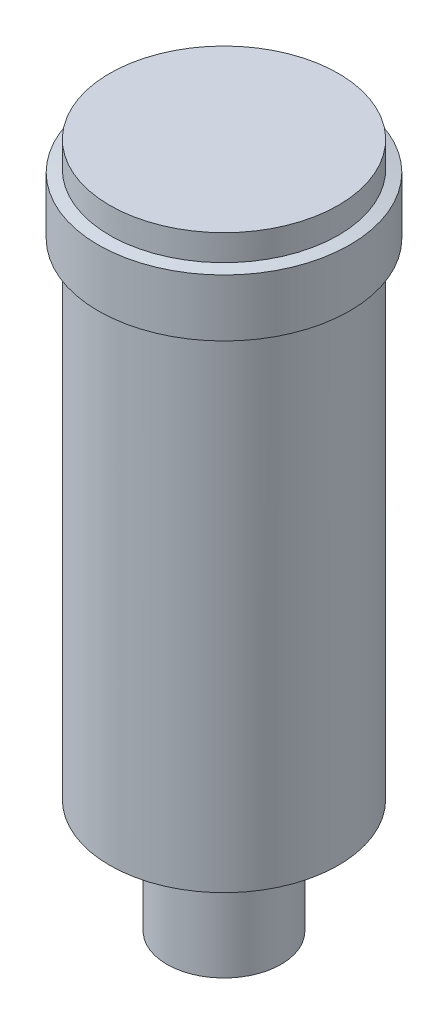
ISO-10303-21;
HEADER;
FILE_DESCRIPTION(('STEP AP214'),'2;1');
FILE_NAME('part.step','',(''),(''),'','','');
FILE_SCHEMA(('AUTOMOTIVE_DESIGN { 1 0 10303 214 1 1 1 1 }'));
ENDSEC;
DATA;
#1=APPLICATION_CONTEXT('core data for automotive mechanical design processes');
#2=APPLICATION_PROTOCOL_DEFINITION('international standard','automotive_design',2000,#1);
#3=PRODUCT_CONTEXT('',#1,'mechanical');
#4=PRODUCT('Part','Part','',(#3));
#5=PRODUCT_RELATED_PRODUCT_CATEGORY('part','',(#4));
#6=PRODUCT_DEFINITION_FORMATION('','',#4);
#7=PRODUCT_DEFINITION_CONTEXT('part definition',#1,'design');
#8=PRODUCT_DEFINITION('design','',#6,#7);
#9=PRODUCT_DEFINITION_SHAPE('','',#8);
#10=(LENGTH_UNIT() NAMED_UNIT(*) SI_UNIT(.MILLI.,.METRE.));
#11=(NAMED_UNIT(*) PLANE_ANGLE_UNIT() SI_UNIT($,.RADIAN.));
#12=(NAMED_UNIT(*) SI_UNIT($,.STERADIAN.) SOLID_ANGLE_UNIT());
#13=UNCERTAINTY_MEASURE_WITH_UNIT(LENGTH_MEASURE(1.E-05),#10,'distance_accuracy_value','');
#14=(GEOMETRIC_REPRESENTATION_CONTEXT(3) GLOBAL_UNCERTAINTY_ASSIGNED_CONTEXT((#13)) GLOBAL_UNIT_ASSIGNED_CONTEXT((#10,
#11,#12)) REPRESENTATION_CONTEXT('',''));
#15=CARTESIAN_POINT('',(0.,0.,0.));
#16=DIRECTION('',(0.,0.,1.));
#17=DIRECTION('',(1.,0.,0.));
#18=AXIS2_PLACEMENT_3D('',#15,#16,#17);
#19=CARTESIAN_POINT('',(0.,12.,0.));
#20=DIRECTION('',(0.,-1.,0.));
#21=DIRECTION('',(0.,0.,-1.));
#22=AXIS2_PLACEMENT_3D('',#19,#20,#21);
#23=CYLINDRICAL_SURFACE('',#22,2.);
#24=CARTESIAN_POINT('',(0.,2.,0.));
#25=DIRECTION('',(0.,1.,0.));
#26=DIRECTION('',(0.,0.,1.));
#27=AXIS2_PLACEMENT_3D('',#24,#25,#26);
#28=CIRCLE('',#27,2.);
#29=CARTESIAN_POINT('',(0.,2.,2.));
#30=VERTEX_POINT('',#29);
#31=EDGE_CURVE('E55',#30,#30,#28,.T.);
#32=ORIENTED_EDGE('',*,*,#31,.T.);
#33=EDGE_LOOP('',(#32));
#34=FACE_BOUND('',#33,.T.);
#35=CARTESIAN_POINT('',(0.,10.4545454545455,0.));
#36=DIRECTION('',(0.,1.,0.));
#37=DIRECTION('',(-1.,0.,0.));
#38=AXIS2_PLACEMENT_3D('',#35,#36,#37);
#39=CIRCLE('',#38,2.);
#40=CARTESIAN_POINT('',(-2.,10.4545454545455,0.));
#41=VERTEX_POINT('',#40);
#42=EDGE_CURVE('E41',#41,#41,#39,.T.);
#43=ORIENTED_EDGE('',*,*,#42,.F.);
#44=EDGE_LOOP('',(#43));
#45=FACE_BOUND('',#44,.T.);
#46=ADVANCED_FACE('F34',(#34,#45),#23,.T.);
#47=CARTESIAN_POINT('',(0.,2.,0.));
#48=DIRECTION('',(0.,-1.,0.));
#49=DIRECTION('',(0.,0.,-1.));
#50=AXIS2_PLACEMENT_3D('',#47,#48,#49);
#51=CYLINDRICAL_SURFACE('',#50,1.);
#52=CARTESIAN_POINT('',(0.,2.,0.));
#53=DIRECTION('',(0.,1.,0.));
#54=DIRECTION('',(0.,0.,1.));
#55=AXIS2_PLACEMENT_3D('',#52,#53,#54);
#56=CIRCLE('',#55,1.);
#57=CARTESIAN_POINT('',(0.,2.,1.));
#58=VERTEX_POINT('',#57);
#59=EDGE_CURVE('E58',#58,#58,#56,.T.);
#60=ORIENTED_EDGE('',*,*,#59,.F.);
#61=EDGE_LOOP('',(#60));
#62=FACE_BOUND('',#61,.T.);
#63=CARTESIAN_POINT('',(0.,0.,0.));
#64=DIRECTION('',(0.,1.,0.));
#65=DIRECTION('',(0.,0.,1.));
#66=AXIS2_PLACEMENT_3D('',#63,#64,#65);
#67=CIRCLE('',#66,1.);
#68=CARTESIAN_POINT('',(0.,0.,1.));
#69=VERTEX_POINT('',#68);
#70=EDGE_CURVE('E54',#69,#69,#67,.T.);
#71=ORIENTED_EDGE('',*,*,#70,.T.);
#72=EDGE_LOOP('',(#71));
#73=FACE_BOUND('',#72,.T.);
#74=ADVANCED_FACE('F36',(#62,#73),#51,.T.);
#75=CARTESIAN_POINT('',(0.,0.,0.));
#76=DIRECTION('',(0.,1.,0.));
#77=DIRECTION('',(0.,0.,1.));
#78=AXIS2_PLACEMENT_3D('',#75,#76,#77);
#79=PLANE('',#78);
#80=ORIENTED_EDGE('',*,*,#70,.F.);
#81=EDGE_LOOP('',(#80));
#82=FACE_BOUND('',#81,.T.);
#83=ADVANCED_FACE('F78',(#82),#79,.F.);
#84=CARTESIAN_POINT('',(0.,2.,0.));
#85=DIRECTION('',(0.,1.,0.));
#86=DIRECTION('',(0.,0.,1.));
#87=AXIS2_PLACEMENT_3D('',#84,#85,#86);
#88=PLANE('',#87);
#89=ORIENTED_EDGE('',*,*,#59,.T.);
#90=EDGE_LOOP('',(#89));
#91=FACE_BOUND('',#90,.T.);
#92=ORIENTED_EDGE('',*,*,#31,.F.);
#93=EDGE_LOOP('',(#92));
#94=FACE_BOUND('',#93,.T.);
#95=ADVANCED_FACE('F89',(#91,#94),#88,.F.);
#96=CARTESIAN_POINT('',(0.,11.5,0.));
#97=DIRECTION('',(0.,-1.,0.));
#98=DIRECTION('',(1.,0.,0.));
#99=AXIS2_PLACEMENT_3D('',#96,#97,#98);
#100=CONICAL_SURFACE('',#99,2.2,1.34731972565426);
#101=CARTESIAN_POINT('',(0.,11.5,0.));
#102=DIRECTION('',(0.,1.,0.));
#103=DIRECTION('',(-1.,0.,0.));
#104=AXIS2_PLACEMENT_3D('',#101,#102,#103);
#105=CIRCLE('',#104,2.2);
#106=CARTESIAN_POINT('',(-2.2,11.5,0.));
#107=VERTEX_POINT('',#106);
#108=EDGE_CURVE('E107',#107,#107,#105,.T.);
#109=ORIENTED_EDGE('',*,*,#108,.T.);
#110=EDGE_LOOP('',(#109));
#111=FACE_BOUND('',#110,.T.);
#112=CARTESIAN_POINT('',(0.,11.5454545454545,0.));
#113=DIRECTION('',(0.,-1.,0.));
#114=DIRECTION('',(1.,0.,0.));
#115=AXIS2_PLACEMENT_3D('',#112,#113,#114);
#116=CIRCLE('',#115,2.);
#117=CARTESIAN_POINT('',(2.,11.5454545454545,0.));
#118=VERTEX_POINT('',#117);
#119=EDGE_CURVE('E11',#118,#118,#116,.T.);
#120=ORIENTED_EDGE('',*,*,#119,.T.);
#121=EDGE_LOOP('',(#120));
#122=FACE_BOUND('',#121,.T.);
#123=ADVANCED_FACE('F87',(#111,#122),#100,.T.);
#124=CARTESIAN_POINT('',(0.,10.,0.));
#125=DIRECTION('',(0.,1.,0.));
#126=DIRECTION('',(-1.,0.,0.));
#127=AXIS2_PLACEMENT_3D('',#124,#125,#126);
#128=CONICAL_SURFACE('',#127,0.,1.34731972565426);
#129=CARTESIAN_POINT('',(0.,10.5,0.));
#130=DIRECTION('',(0.,1.,0.));
#131=DIRECTION('',(-1.,0.,0.));
#132=AXIS2_PLACEMENT_3D('',#129,#130,#131);
#133=CIRCLE('',#132,2.2);
#134=CARTESIAN_POINT('',(-2.2,10.5,0.));
#135=VERTEX_POINT('',#134);
#136=EDGE_CURVE('E61',#135,#135,#133,.T.);
#137=ORIENTED_EDGE('',*,*,#136,.F.);
#138=EDGE_LOOP('',(#137));
#139=FACE_BOUND('',#138,.T.);
#140=ORIENTED_EDGE('',*,*,#42,.T.);
#141=EDGE_LOOP('',(#140));
#142=FACE_BOUND('',#141,.T.);
#143=ADVANCED_FACE('F70',(#139,#142),#128,.T.);
#144=CARTESIAN_POINT('',(0.,12.,0.));
#145=DIRECTION('',(0.,1.,0.));
#146=DIRECTION('',(-1.,0.,0.));
#147=AXIS2_PLACEMENT_3D('',#144,#145,#146);
#148=CYLINDRICAL_SURFACE('',#147,2.2);
#149=ORIENTED_EDGE('',*,*,#108,.F.);
#150=EDGE_LOOP('',(#149));
#151=FACE_BOUND('',#150,.T.);
#152=ORIENTED_EDGE('',*,*,#136,.T.);
#153=EDGE_LOOP('',(#152));
#154=FACE_BOUND('',#153,.T.);
#155=ADVANCED_FACE('F48',(#151,#154),#148,.T.);
#156=CARTESIAN_POINT('',(0.,12.,0.));
#157=DIRECTION('',(0.,1.,0.));
#158=DIRECTION('',(0.,0.,1.));
#159=AXIS2_PLACEMENT_3D('',#156,#157,#158);
#160=PLANE('',#159);
#161=CARTESIAN_POINT('',(0.,12.,0.));
#162=VERTEX_POINT('',#161);
#163=VERTEX_LOOP('',#162);
#164=FACE_BOUND('',#163,.T.);
#165=CARTESIAN_POINT('',(0.,12.,0.));
#166=DIRECTION('',(0.,1.,0.));
#167=DIRECTION('',(0.,0.,1.));
#168=AXIS2_PLACEMENT_3D('',#165,#166,#167);
#169=CIRCLE('',#168,2.);
#170=CARTESIAN_POINT('',(0.,12.,2.));
#171=VERTEX_POINT('',#170);
#172=EDGE_CURVE('E52',#171,#171,#169,.T.);
#173=ORIENTED_EDGE('',*,*,#172,.T.);
#174=EDGE_LOOP('',(#173));
#175=FACE_BOUND('',#174,.T.);
#176=ADVANCED_FACE('F44',(#164,#175),#160,.T.);
#177=ORIENTED_EDGE('',*,*,#172,.F.);
#178=EDGE_LOOP('',(#177));
#179=FACE_BOUND('',#178,.T.);
#180=ORIENTED_EDGE('',*,*,#119,.F.);
#181=EDGE_LOOP('',(#180));
#182=FACE_BOUND('',#181,.T.);
#183=ADVANCED_FACE('F47',(#179,#182),#23,.T.);
#184=CLOSED_SHELL('',(#46,#74,#83,#95,#123,#143,#155,#176,#183));
#185=MANIFOLD_SOLID_BREP('B2',#184);
#186=ADVANCED_BREP_SHAPE_REPRESENTATION('',(#18,#185),#14);
#187=SHAPE_DEFINITION_REPRESENTATION(#9,#186);
ENDSEC;
END-ISO-10303-21;
